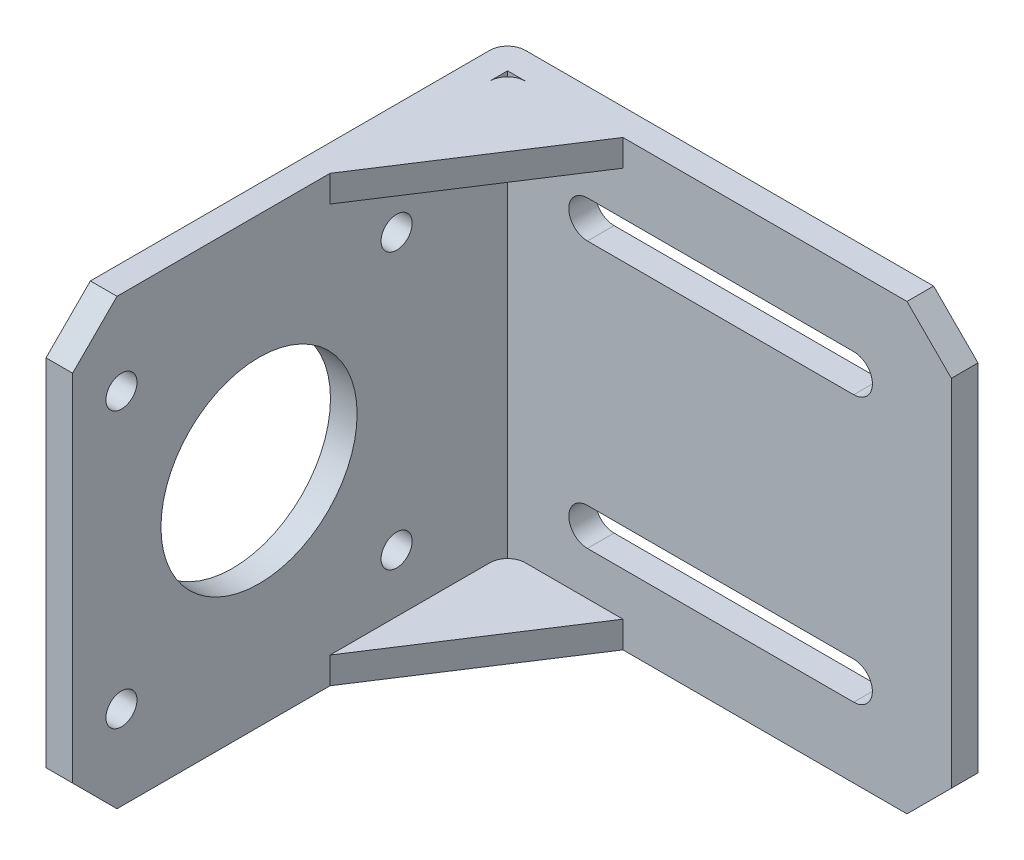
ISO-10303-21;
HEADER;
FILE_DESCRIPTION(('STEP AP214'),'2;1');
FILE_NAME('part.step','',(''),(''),'','','');
FILE_SCHEMA(('AUTOMOTIVE_DESIGN { 1 0 10303 214 1 1 1 1 }'));
ENDSEC;
DATA;
#1=APPLICATION_CONTEXT('core data for automotive mechanical design processes');
#2=APPLICATION_PROTOCOL_DEFINITION('international standard','automotive_design',2000,#1);
#3=PRODUCT_CONTEXT('',#1,'mechanical');
#4=PRODUCT('Part','Part','',(#3));
#5=PRODUCT_RELATED_PRODUCT_CATEGORY('part','',(#4));
#6=PRODUCT_DEFINITION_FORMATION('','',#4);
#7=PRODUCT_DEFINITION_CONTEXT('part definition',#1,'design');
#8=PRODUCT_DEFINITION('design','',#6,#7);
#9=PRODUCT_DEFINITION_SHAPE('','',#8);
#10=(LENGTH_UNIT() NAMED_UNIT(*) SI_UNIT(.MILLI.,.METRE.));
#11=(NAMED_UNIT(*) PLANE_ANGLE_UNIT() SI_UNIT($,.RADIAN.));
#12=(NAMED_UNIT(*) SI_UNIT($,.STERADIAN.) SOLID_ANGLE_UNIT());
#13=UNCERTAINTY_MEASURE_WITH_UNIT(LENGTH_MEASURE(1.E-05),#10,'distance_accuracy_value','');
#14=(GEOMETRIC_REPRESENTATION_CONTEXT(3) GLOBAL_UNCERTAINTY_ASSIGNED_CONTEXT((#13)) GLOBAL_UNIT_ASSIGNED_CONTEXT((#10,
#11,#12)) REPRESENTATION_CONTEXT('',''));
#15=CARTESIAN_POINT('',(0.,0.,0.));
#16=DIRECTION('',(0.,0.,1.));
#17=DIRECTION('',(1.,0.,0.));
#18=AXIS2_PLACEMENT_3D('',#15,#16,#17);
#19=CARTESIAN_POINT('',(0.,0.,3.));
#20=DIRECTION('',(0.,0.,1.));
#21=DIRECTION('',(1.,0.,0.));
#22=AXIS2_PLACEMENT_3D('',#19,#20,#21);
#23=PLANE('',#22);
#24=DIRECTION('',(1.,0.,0.));
#25=VECTOR('',#24,1.);
#26=CARTESIAN_POINT('',(-14.5,12.8966764515203,3.));
#27=LINE('',#26,#25);
#28=CARTESIAN_POINT('',(-14.5,12.8966764515203,3.));
#29=VERTEX_POINT('',#28);
#30=CARTESIAN_POINT('',(15.5,12.8966764515203,3.));
#31=VERTEX_POINT('',#30);
#32=EDGE_CURVE('E355',#29,#31,#27,.T.);
#33=ORIENTED_EDGE('',*,*,#32,.F.);
#34=CARTESIAN_POINT('',(-14.5,15.,3.));
#35=DIRECTION('',(0.,0.,1.));
#36=DIRECTION('',(1.,0.,0.));
#37=AXIS2_PLACEMENT_3D('',#34,#35,#36);
#38=CIRCLE('',#37,2.10332354847967);
#39=CARTESIAN_POINT('',(-14.5,17.1033235484797,3.));
#40=VERTEX_POINT('',#39);
#41=EDGE_CURVE('E353',#40,#29,#38,.T.);
#42=ORIENTED_EDGE('',*,*,#41,.F.);
#43=DIRECTION('',(-1.,0.,0.));
#44=VECTOR('',#43,1.);
#45=CARTESIAN_POINT('',(-14.5,17.1033235484797,3.));
#46=LINE('',#45,#44);
#47=CARTESIAN_POINT('',(15.5,17.1033235484797,3.));
#48=VERTEX_POINT('',#47);
#49=EDGE_CURVE('E361',#48,#40,#46,.T.);
#50=ORIENTED_EDGE('',*,*,#49,.F.);
#51=CARTESIAN_POINT('',(15.5,15.,3.));
#52=DIRECTION('',(0.,0.,1.));
#53=DIRECTION('',(1.,0.,0.));
#54=AXIS2_PLACEMENT_3D('',#51,#52,#53);
#55=CIRCLE('',#54,2.10332354847967);
#56=EDGE_CURVE('E358',#31,#48,#55,.T.);
#57=ORIENTED_EDGE('',*,*,#56,.F.);
#58=EDGE_LOOP('',(#33,#42,#50,#57));
#59=FACE_BOUND('',#58,.T.);
#60=DIRECTION('',(1.,0.,0.));
#61=VECTOR('',#60,1.);
#62=CARTESIAN_POINT('',(-14.5,-17.1,3.));
#63=LINE('',#62,#61);
#64=CARTESIAN_POINT('',(-14.5,-17.1,3.));
#65=VERTEX_POINT('',#64);
#66=CARTESIAN_POINT('',(15.5,-17.1,3.));
#67=VERTEX_POINT('',#66);
#68=EDGE_CURVE('E324',#65,#67,#63,.T.);
#69=ORIENTED_EDGE('',*,*,#68,.F.);
#70=CARTESIAN_POINT('',(-14.5,-15.,3.));
#71=DIRECTION('',(0.,0.,1.));
#72=DIRECTION('',(1.,0.,0.));
#73=AXIS2_PLACEMENT_3D('',#70,#71,#72);
#74=CIRCLE('',#73,2.1);
#75=CARTESIAN_POINT('',(-14.5,-12.9,3.));
#76=VERTEX_POINT('',#75);
#77=EDGE_CURVE('E322',#76,#65,#74,.T.);
#78=ORIENTED_EDGE('',*,*,#77,.F.);
#79=DIRECTION('',(-1.,0.,0.));
#80=VECTOR('',#79,1.);
#81=CARTESIAN_POINT('',(-14.5,-12.9,3.));
#82=LINE('',#81,#80);
#83=CARTESIAN_POINT('',(15.5,-12.9,3.));
#84=VERTEX_POINT('',#83);
#85=EDGE_CURVE('E330',#84,#76,#82,.T.);
#86=ORIENTED_EDGE('',*,*,#85,.F.);
#87=CARTESIAN_POINT('',(15.5,-15.,3.));
#88=DIRECTION('',(0.,0.,1.));
#89=DIRECTION('',(1.,0.,0.));
#90=AXIS2_PLACEMENT_3D('',#87,#88,#89);
#91=CIRCLE('',#90,2.1);
#92=EDGE_CURVE('E327',#67,#84,#91,.T.);
#93=ORIENTED_EDGE('',*,*,#92,.F.);
#94=EDGE_LOOP('',(#69,#78,#86,#93));
#95=FACE_BOUND('',#94,.T.);
#96=DIRECTION('',(-1.,0.,0.));
#97=VECTOR('',#96,1.);
#98=CARTESIAN_POINT('',(26.5,25.,3.));
#99=LINE('',#98,#97);
#100=CARTESIAN_POINT('',(21.5,25.,3.));
#101=VERTEX_POINT('',#100);
#102=CARTESIAN_POINT('',(-10.5,25.,3.));
#103=VERTEX_POINT('',#102);
#104=EDGE_CURVE('E391',#101,#103,#99,.T.);
#105=ORIENTED_EDGE('',*,*,#104,.T.);
#106=DIRECTION('',(0.,1.,0.));
#107=VECTOR('',#106,1.);
#108=CARTESIAN_POINT('',(-10.5,22.,3.));
#109=LINE('',#108,#107);
#110=CARTESIAN_POINT('',(-10.5,22.,3.));
#111=VERTEX_POINT('',#110);
#112=EDGE_CURVE('E60',#111,#103,#109,.T.);
#113=ORIENTED_EDGE('',*,*,#112,.F.);
#114=DIRECTION('',(1.,0.,0.));
#115=VECTOR('',#114,1.);
#116=CARTESIAN_POINT('',(-21.5,22.,3.));
#117=LINE('',#116,#115);
#118=CARTESIAN_POINT('',(-21.5,22.,3.));
#119=VERTEX_POINT('',#118);
#120=EDGE_CURVE('E55',#119,#111,#117,.T.);
#121=ORIENTED_EDGE('',*,*,#120,.F.);
#122=DIRECTION('',(0.,1.,0.));
#123=VECTOR('',#122,1.);
#124=CARTESIAN_POINT('',(-21.5,22.,3.));
#125=LINE('',#124,#123);
#126=CARTESIAN_POINT('',(-21.5,25.,3.));
#127=VERTEX_POINT('',#126);
#128=EDGE_CURVE('E234',#119,#127,#125,.T.);
#129=ORIENTED_EDGE('',*,*,#128,.T.);
#130=CARTESIAN_POINT('',(-23.5,25.,3.));
#131=VERTEX_POINT('',#130);
#132=EDGE_CURVE('E390',#127,#131,#99,.T.);
#133=ORIENTED_EDGE('',*,*,#132,.T.);
#134=DIRECTION('',(0.,-1.,0.));
#135=VECTOR('',#134,1.);
#136=CARTESIAN_POINT('',(-23.5,25.,3.));
#137=LINE('',#136,#135);
#138=CARTESIAN_POINT('',(-23.5,-25.,3.));
#139=VERTEX_POINT('',#138);
#140=EDGE_CURVE('E312',#131,#139,#137,.T.);
#141=ORIENTED_EDGE('',*,*,#140,.T.);
#142=DIRECTION('',(1.,0.,0.));
#143=VECTOR('',#142,1.);
#144=CARTESIAN_POINT('',(26.5,-25.,3.));
#145=LINE('',#144,#143);
#146=CARTESIAN_POINT('',(-21.5,-25.,3.));
#147=VERTEX_POINT('',#146);
#148=EDGE_CURVE('E384',#139,#147,#145,.T.);
#149=ORIENTED_EDGE('',*,*,#148,.T.);
#150=DIRECTION('',(0.,-1.,0.));
#151=VECTOR('',#150,1.);
#152=CARTESIAN_POINT('',(-21.5,-22.,3.));
#153=LINE('',#152,#151);
#154=CARTESIAN_POINT('',(-21.5,-22.,3.));
#155=VERTEX_POINT('',#154);
#156=EDGE_CURVE('E268',#155,#147,#153,.T.);
#157=ORIENTED_EDGE('',*,*,#156,.F.);
#158=DIRECTION('',(1.,0.,0.));
#159=VECTOR('',#158,1.);
#160=CARTESIAN_POINT('',(-21.5,-22.,3.));
#161=LINE('',#160,#159);
#162=CARTESIAN_POINT('',(-10.5,-22.,3.));
#163=VERTEX_POINT('',#162);
#164=EDGE_CURVE('E258',#155,#163,#161,.T.);
#165=ORIENTED_EDGE('',*,*,#164,.T.);
#166=DIRECTION('',(0.,-1.,0.));
#167=VECTOR('',#166,1.);
#168=CARTESIAN_POINT('',(-10.5,-22.,3.));
#169=LINE('',#168,#167);
#170=CARTESIAN_POINT('',(-10.5,-25.,3.));
#171=VERTEX_POINT('',#170);
#172=EDGE_CURVE('E264',#163,#171,#169,.T.);
#173=ORIENTED_EDGE('',*,*,#172,.T.);
#174=CARTESIAN_POINT('',(21.5,-25.,3.));
#175=VERTEX_POINT('',#174);
#176=EDGE_CURVE('E387',#171,#175,#145,.T.);
#177=ORIENTED_EDGE('',*,*,#176,.T.);
#178=DIRECTION('',(-0.707106781186549,-0.707106781186547,0.));
#179=VECTOR('',#178,1.);
#180=CARTESIAN_POINT('',(23.25,-23.25,3.));
#181=LINE('',#180,#179);
#182=CARTESIAN_POINT('',(26.5,-20.,3.));
#183=VERTEX_POINT('',#182);
#184=EDGE_CURVE('E424',#175,#183,#181,.F.);
#185=ORIENTED_EDGE('',*,*,#184,.T.);
#186=DIRECTION('',(0.,1.,0.));
#187=VECTOR('',#186,1.);
#188=CARTESIAN_POINT('',(26.5,-25.,3.));
#189=LINE('',#188,#187);
#190=CARTESIAN_POINT('',(26.5,20.,3.));
#191=VERTEX_POINT('',#190);
#192=EDGE_CURVE('E386',#183,#191,#189,.T.);
#193=ORIENTED_EDGE('',*,*,#192,.T.);
#194=DIRECTION('',(0.707106781186547,-0.707106781186549,0.));
#195=VECTOR('',#194,1.);
#196=CARTESIAN_POINT('',(23.25,23.25,3.));
#197=LINE('',#196,#195);
#198=EDGE_CURVE('E422',#191,#101,#197,.F.);
#199=ORIENTED_EDGE('',*,*,#198,.T.);
#200=EDGE_LOOP('',(#105,#113,#121,#129,#133,#141,#149,#157,#165,#173,#177,#185,#193,#199));
#201=FACE_BOUND('',#200,.T.);
#202=ADVANCED_FACE('F40',(#59,#95,#201),#23,.T.);
#203=CARTESIAN_POINT('',(-23.5,0.,0.));
#204=DIRECTION('',(1.,0.,0.));
#205=DIRECTION('',(0.,0.,-1.));
#206=AXIS2_PLACEMENT_3D('',#203,#204,#205);
#207=PLANE('',#206);
#208=CARTESIAN_POINT('',(-23.5,15.4999999999999,15.5));
#209=DIRECTION('',(-1.,0.,0.));
#210=DIRECTION('',(0.,0.,1.));
#211=AXIS2_PLACEMENT_3D('',#208,#209,#210);
#212=CIRCLE('',#211,1.75);
#213=CARTESIAN_POINT('',(-23.5,15.4999999999999,17.25));
#214=VERTEX_POINT('',#213);
#215=EDGE_CURVE('E276',#214,#214,#212,.T.);
#216=ORIENTED_EDGE('',*,*,#215,.T.);
#217=EDGE_LOOP('',(#216));
#218=FACE_BOUND('',#217,.T.);
#219=CARTESIAN_POINT('',(-23.5,-15.5000000000001,15.5));
#220=DIRECTION('',(-1.,0.,0.));
#221=DIRECTION('',(0.,0.,1.));
#222=AXIS2_PLACEMENT_3D('',#219,#220,#221);
#223=CIRCLE('',#222,1.75);
#224=CARTESIAN_POINT('',(-23.5,-15.5000000000001,17.25));
#225=VERTEX_POINT('',#224);
#226=EDGE_CURVE('E282',#225,#225,#223,.T.);
#227=ORIENTED_EDGE('',*,*,#226,.T.);
#228=EDGE_LOOP('',(#227));
#229=FACE_BOUND('',#228,.T.);
#230=CARTESIAN_POINT('',(-23.5,-15.5000000000001,46.5));
#231=DIRECTION('',(-1.,0.,0.));
#232=DIRECTION('',(0.,0.,1.));
#233=AXIS2_PLACEMENT_3D('',#230,#231,#232);
#234=CIRCLE('',#233,1.75);
#235=CARTESIAN_POINT('',(-23.5,-15.5000000000001,48.25));
#236=VERTEX_POINT('',#235);
#237=EDGE_CURVE('E288',#236,#236,#234,.T.);
#238=ORIENTED_EDGE('',*,*,#237,.T.);
#239=EDGE_LOOP('',(#238));
#240=FACE_BOUND('',#239,.T.);
#241=CARTESIAN_POINT('',(-23.5,15.4999999999999,46.5));
#242=DIRECTION('',(-1.,0.,0.));
#243=DIRECTION('',(0.,0.,1.));
#244=AXIS2_PLACEMENT_3D('',#241,#242,#243);
#245=CIRCLE('',#244,1.75);
#246=CARTESIAN_POINT('',(-23.5,15.4999999999999,48.25));
#247=VERTEX_POINT('',#246);
#248=EDGE_CURVE('E294',#247,#247,#245,.T.);
#249=ORIENTED_EDGE('',*,*,#248,.T.);
#250=EDGE_LOOP('',(#249));
#251=FACE_BOUND('',#250,.T.);
#252=CARTESIAN_POINT('',(-23.5,0.,31.));
#253=DIRECTION('',(-1.,0.,0.));
#254=DIRECTION('',(0.,0.,1.));
#255=AXIS2_PLACEMENT_3D('',#252,#253,#254);
#256=CIRCLE('',#255,11.05);
#257=CARTESIAN_POINT('',(-23.5,0.,42.05));
#258=VERTEX_POINT('',#257);
#259=EDGE_CURVE('E300',#258,#258,#256,.T.);
#260=ORIENTED_EDGE('',*,*,#259,.T.);
#261=EDGE_LOOP('',(#260));
#262=FACE_BOUND('',#261,.T.);
#263=DIRECTION('',(0.,0.,-1.));
#264=VECTOR('',#263,1.);
#265=CARTESIAN_POINT('',(-23.5,22.,5.));
#266=LINE('',#265,#264);
#267=CARTESIAN_POINT('',(-23.5,22.,23.));
#268=VERTEX_POINT('',#267);
#269=CARTESIAN_POINT('',(-23.5,22.,5.));
#270=VERTEX_POINT('',#269);
#271=EDGE_CURVE('E216',#268,#270,#266,.T.);
#272=ORIENTED_EDGE('',*,*,#271,.F.);
#273=DIRECTION('',(0.,1.,0.));
#274=VECTOR('',#273,1.);
#275=CARTESIAN_POINT('',(-23.5,22.,23.));
#276=LINE('',#275,#274);
#277=CARTESIAN_POINT('',(-23.5,25.,23.));
#278=VERTEX_POINT('',#277);
#279=EDGE_CURVE('E240',#268,#278,#276,.T.);
#280=ORIENTED_EDGE('',*,*,#279,.T.);
#281=DIRECTION('',(0.,0.,-1.));
#282=VECTOR('',#281,1.);
#283=CARTESIAN_POINT('',(-23.5,25.,3.));
#284=LINE('',#283,#282);
#285=CARTESIAN_POINT('',(-23.5,25.,47.));
#286=VERTEX_POINT('',#285);
#287=EDGE_CURVE('E309',#286,#278,#284,.T.);
#288=ORIENTED_EDGE('',*,*,#287,.F.);
#289=DIRECTION('',(0.,-0.707106781186547,0.707106781186549));
#290=VECTOR('',#289,1.);
#291=CARTESIAN_POINT('',(-23.5,36.,35.9999999999999));
#292=LINE('',#291,#290);
#293=CARTESIAN_POINT('',(-23.5,20.,52.));
#294=VERTEX_POINT('',#293);
#295=EDGE_CURVE('E440',#286,#294,#292,.T.);
#296=ORIENTED_EDGE('',*,*,#295,.T.);
#297=DIRECTION('',(0.,1.,0.));
#298=VECTOR('',#297,1.);
#299=CARTESIAN_POINT('',(-23.5,25.,52.));
#300=LINE('',#299,#298);
#301=CARTESIAN_POINT('',(-23.5,-20.,52.));
#302=VERTEX_POINT('',#301);
#303=EDGE_CURVE('E306',#302,#294,#300,.T.);
#304=ORIENTED_EDGE('',*,*,#303,.F.);
#305=DIRECTION('',(0.,-0.707106781186549,-0.707106781186546));
#306=VECTOR('',#305,1.);
#307=CARTESIAN_POINT('',(-23.5,-35.9999999999999,36.0000000000001));
#308=LINE('',#307,#306);
#309=CARTESIAN_POINT('',(-23.5,-25.,47.));
#310=VERTEX_POINT('',#309);
#311=EDGE_CURVE('E442',#302,#310,#308,.T.);
#312=ORIENTED_EDGE('',*,*,#311,.T.);
#313=DIRECTION('',(0.,0.,1.));
#314=VECTOR('',#313,1.);
#315=CARTESIAN_POINT('',(-23.5,-25.,52.));
#316=LINE('',#315,#314);
#317=CARTESIAN_POINT('',(-23.5,-25.,23.));
#318=VERTEX_POINT('',#317);
#319=EDGE_CURVE('E315',#318,#310,#316,.T.);
#320=ORIENTED_EDGE('',*,*,#319,.F.);
#321=DIRECTION('',(0.,-1.,0.));
#322=VECTOR('',#321,1.);
#323=CARTESIAN_POINT('',(-23.5,-22.,23.));
#324=LINE('',#323,#322);
#325=CARTESIAN_POINT('',(-23.5,-22.,23.));
#326=VERTEX_POINT('',#325);
#327=EDGE_CURVE('E260',#326,#318,#324,.T.);
#328=ORIENTED_EDGE('',*,*,#327,.F.);
#329=DIRECTION('',(0.,0.,-1.));
#330=VECTOR('',#329,1.);
#331=CARTESIAN_POINT('',(-23.5,-22.,5.));
#332=LINE('',#331,#330);
#333=CARTESIAN_POINT('',(-23.5,-22.,5.));
#334=VERTEX_POINT('',#333);
#335=EDGE_CURVE('E251',#326,#334,#332,.T.);
#336=ORIENTED_EDGE('',*,*,#335,.T.);
#337=DIRECTION('',(0.,-1.,0.));
#338=VECTOR('',#337,1.);
#339=CARTESIAN_POINT('',(-23.5,-22.,5.));
#340=LINE('',#339,#338);
#341=CARTESIAN_POINT('',(-23.5,-25.,5.));
#342=VERTEX_POINT('',#341);
#343=EDGE_CURVE('E271',#334,#342,#340,.T.);
#344=ORIENTED_EDGE('',*,*,#343,.T.);
#345=EDGE_CURVE('E316',#139,#342,#316,.T.);
#346=ORIENTED_EDGE('',*,*,#345,.F.);
#347=ORIENTED_EDGE('',*,*,#140,.F.);
#348=CARTESIAN_POINT('',(-23.5,25.,5.));
#349=VERTEX_POINT('',#348);
#350=EDGE_CURVE('E239',#349,#131,#284,.T.);
#351=ORIENTED_EDGE('',*,*,#350,.F.);
#352=DIRECTION('',(0.,1.,0.));
#353=VECTOR('',#352,1.);
#354=CARTESIAN_POINT('',(-23.5,22.,5.));
#355=LINE('',#354,#353);
#356=EDGE_CURVE('E232',#270,#349,#355,.T.);
#357=ORIENTED_EDGE('',*,*,#356,.F.);
#358=EDGE_LOOP('',(#272,#280,#288,#296,#304,#312,#320,#328,#336,#344,#346,#347,#351,#357));
#359=FACE_BOUND('',#358,.T.);
#360=ADVANCED_FACE('F236',(#218,#229,#240,#251,#262,#359),#207,.T.);
#361=CARTESIAN_POINT('',(0.,0.,0.));
#362=DIRECTION('',(0.,0.,1.));
#363=DIRECTION('',(1.,0.,0.));
#364=AXIS2_PLACEMENT_3D('',#361,#362,#363);
#365=PLANE('',#364);
#366=CARTESIAN_POINT('',(-14.5,15.,0.));
#367=DIRECTION('',(0.,0.,1.));
#368=DIRECTION('',(1.,0.,0.));
#369=AXIS2_PLACEMENT_3D('',#366,#367,#368);
#370=CIRCLE('',#369,2.10332354847967);
#371=CARTESIAN_POINT('',(-14.5,17.1033235484797,0.));
#372=VERTEX_POINT('',#371);
#373=CARTESIAN_POINT('',(-14.5,12.8966764515203,0.));
#374=VERTEX_POINT('',#373);
#375=EDGE_CURVE('E352',#372,#374,#370,.T.);
#376=ORIENTED_EDGE('',*,*,#375,.T.);
#377=DIRECTION('',(1.,0.,0.));
#378=VECTOR('',#377,1.);
#379=CARTESIAN_POINT('',(-14.5,12.8966764515203,0.));
#380=LINE('',#379,#378);
#381=CARTESIAN_POINT('',(15.5,12.8966764515203,0.));
#382=VERTEX_POINT('',#381);
#383=EDGE_CURVE('E366',#374,#382,#380,.T.);
#384=ORIENTED_EDGE('',*,*,#383,.T.);
#385=CARTESIAN_POINT('',(15.5,15.,0.));
#386=DIRECTION('',(0.,0.,1.));
#387=DIRECTION('',(1.,0.,0.));
#388=AXIS2_PLACEMENT_3D('',#385,#386,#387);
#389=CIRCLE('',#388,2.10332354847967);
#390=CARTESIAN_POINT('',(15.5,17.1033235484797,0.));
#391=VERTEX_POINT('',#390);
#392=EDGE_CURVE('E369',#382,#391,#389,.T.);
#393=ORIENTED_EDGE('',*,*,#392,.T.);
#394=DIRECTION('',(-1.,0.,0.));
#395=VECTOR('',#394,1.);
#396=CARTESIAN_POINT('',(-14.5,17.1033235484797,0.));
#397=LINE('',#396,#395);
#398=EDGE_CURVE('E356',#391,#372,#397,.T.);
#399=ORIENTED_EDGE('',*,*,#398,.T.);
#400=EDGE_LOOP('',(#376,#384,#393,#399));
#401=FACE_BOUND('',#400,.T.);
#402=DIRECTION('',(1.,0.,0.));
#403=VECTOR('',#402,1.);
#404=CARTESIAN_POINT('',(26.5,-25.,0.));
#405=LINE('',#404,#403);
#406=CARTESIAN_POINT('',(-24.5,-25.,0.));
#407=VERTEX_POINT('',#406);
#408=CARTESIAN_POINT('',(21.5,-25.,0.));
#409=VERTEX_POINT('',#408);
#410=EDGE_CURVE('E383',#407,#409,#405,.T.);
#411=ORIENTED_EDGE('',*,*,#410,.F.);
#412=DIRECTION('',(0.,-1.,0.));
#413=VECTOR('',#412,1.);
#414=CARTESIAN_POINT('',(-24.5,0.,0.));
#415=LINE('',#414,#413);
#416=CARTESIAN_POINT('',(-24.5,25.,0.));
#417=VERTEX_POINT('',#416);
#418=EDGE_CURVE('E48',#407,#417,#415,.F.);
#419=ORIENTED_EDGE('',*,*,#418,.T.);
#420=DIRECTION('',(-1.,0.,0.));
#421=VECTOR('',#420,1.);
#422=CARTESIAN_POINT('',(26.5,25.,0.));
#423=LINE('',#422,#421);
#424=CARTESIAN_POINT('',(21.5,25.,0.));
#425=VERTEX_POINT('',#424);
#426=EDGE_CURVE('E398',#425,#417,#423,.T.);
#427=ORIENTED_EDGE('',*,*,#426,.F.);
#428=DIRECTION('',(-0.707106781186547,0.707106781186549,0.));
#429=VECTOR('',#428,1.);
#430=CARTESIAN_POINT('',(21.5,25.,0.));
#431=LINE('',#430,#429);
#432=CARTESIAN_POINT('',(26.5,20.,0.));
#433=VERTEX_POINT('',#432);
#434=EDGE_CURVE('E411',#425,#433,#431,.F.);
#435=ORIENTED_EDGE('',*,*,#434,.T.);
#436=DIRECTION('',(0.,1.,0.));
#437=VECTOR('',#436,1.);
#438=CARTESIAN_POINT('',(26.5,-25.,0.));
#439=LINE('',#438,#437);
#440=CARTESIAN_POINT('',(26.5,-20.,0.));
#441=VERTEX_POINT('',#440);
#442=EDGE_CURVE('E395',#441,#433,#439,.T.);
#443=ORIENTED_EDGE('',*,*,#442,.F.);
#444=DIRECTION('',(0.707106781186549,0.707106781186547,0.));
#445=VECTOR('',#444,1.);
#446=CARTESIAN_POINT('',(26.5,-20.,0.));
#447=LINE('',#446,#445);
#448=EDGE_CURVE('E413',#441,#409,#447,.F.);
#449=ORIENTED_EDGE('',*,*,#448,.T.);
#450=EDGE_LOOP('',(#411,#419,#427,#435,#443,#449));
#451=FACE_BOUND('',#450,.T.);
#452=CARTESIAN_POINT('',(-14.5,-15.,0.));
#453=DIRECTION('',(0.,0.,1.));
#454=DIRECTION('',(1.,0.,0.));
#455=AXIS2_PLACEMENT_3D('',#452,#453,#454);
#456=CIRCLE('',#455,2.1);
#457=CARTESIAN_POINT('',(-14.5,-12.9,0.));
#458=VERTEX_POINT('',#457);
#459=CARTESIAN_POINT('',(-14.5,-17.1,0.));
#460=VERTEX_POINT('',#459);
#461=EDGE_CURVE('E319',#458,#460,#456,.T.);
#462=ORIENTED_EDGE('',*,*,#461,.T.);
#463=DIRECTION('',(1.,0.,0.));
#464=VECTOR('',#463,1.);
#465=CARTESIAN_POINT('',(-14.5,-17.1,0.));
#466=LINE('',#465,#464);
#467=CARTESIAN_POINT('',(15.5,-17.1,0.));
#468=VERTEX_POINT('',#467);
#469=EDGE_CURVE('E335',#460,#468,#466,.T.);
#470=ORIENTED_EDGE('',*,*,#469,.T.);
#471=CARTESIAN_POINT('',(15.5,-15.,0.));
#472=DIRECTION('',(0.,0.,1.));
#473=DIRECTION('',(1.,0.,0.));
#474=AXIS2_PLACEMENT_3D('',#471,#472,#473);
#475=CIRCLE('',#474,2.1);
#476=CARTESIAN_POINT('',(15.5,-12.9,0.));
#477=VERTEX_POINT('',#476);
#478=EDGE_CURVE('E338',#468,#477,#475,.T.);
#479=ORIENTED_EDGE('',*,*,#478,.T.);
#480=DIRECTION('',(-1.,0.,0.));
#481=VECTOR('',#480,1.);
#482=CARTESIAN_POINT('',(-14.5,-12.9,0.));
#483=LINE('',#482,#481);
#484=EDGE_CURVE('E325',#477,#458,#483,.T.);
#485=ORIENTED_EDGE('',*,*,#484,.T.);
#486=EDGE_LOOP('',(#462,#470,#479,#485));
#487=FACE_BOUND('',#486,.T.);
#488=ADVANCED_FACE('F453',(#401,#451,#487),#365,.F.);
#489=CARTESIAN_POINT('',(-26.5,-25.,3.));
#490=DIRECTION('',(1.,0.,0.));
#491=DIRECTION('',(0.,0.,-1.));
#492=AXIS2_PLACEMENT_3D('',#489,#490,#491);
#493=PLANE('',#492);
#494=DIRECTION('',(0.,0.,-1.));
#495=VECTOR('',#494,1.);
#496=CARTESIAN_POINT('',(-26.5,25.,3.));
#497=LINE('',#496,#495);
#498=CARTESIAN_POINT('',(-26.5,25.,47.));
#499=VERTEX_POINT('',#498);
#500=CARTESIAN_POINT('',(-26.5,25.,2.));
#501=VERTEX_POINT('',#500);
#502=EDGE_CURVE('E393',#499,#501,#497,.T.);
#503=ORIENTED_EDGE('',*,*,#502,.T.);
#504=DIRECTION('',(0.,-1.,0.));
#505=VECTOR('',#504,1.);
#506=CARTESIAN_POINT('',(-26.5,-25.,2.));
#507=LINE('',#506,#505);
#508=CARTESIAN_POINT('',(-26.5,-25.,2.));
#509=VERTEX_POINT('',#508);
#510=EDGE_CURVE('E445',#501,#509,#507,.T.);
#511=ORIENTED_EDGE('',*,*,#510,.T.);
#512=DIRECTION('',(0.,0.,-1.));
#513=VECTOR('',#512,1.);
#514=CARTESIAN_POINT('',(-26.5,-25.,3.));
#515=LINE('',#514,#513);
#516=CARTESIAN_POINT('',(-26.5,-25.,47.));
#517=VERTEX_POINT('',#516);
#518=EDGE_CURVE('E403',#517,#509,#515,.T.);
#519=ORIENTED_EDGE('',*,*,#518,.F.);
#520=DIRECTION('',(0.,0.707106781186549,0.707106781186546));
#521=VECTOR('',#520,1.);
#522=CARTESIAN_POINT('',(-26.5,-25.,47.));
#523=LINE('',#522,#521);
#524=CARTESIAN_POINT('',(-26.5,-20.,52.));
#525=VERTEX_POINT('',#524);
#526=EDGE_CURVE('E433',#517,#525,#523,.T.);
#527=ORIENTED_EDGE('',*,*,#526,.T.);
#528=DIRECTION('',(0.,1.,0.));
#529=VECTOR('',#528,1.);
#530=CARTESIAN_POINT('',(-26.5,25.,52.));
#531=LINE('',#530,#529);
#532=CARTESIAN_POINT('',(-26.5,20.,52.));
#533=VERTEX_POINT('',#532);
#534=EDGE_CURVE('E303',#525,#533,#531,.T.);
#535=ORIENTED_EDGE('',*,*,#534,.T.);
#536=DIRECTION('',(0.,0.707106781186547,-0.707106781186549));
#537=VECTOR('',#536,1.);
#538=CARTESIAN_POINT('',(-26.5,20.,52.));
#539=LINE('',#538,#537);
#540=EDGE_CURVE('E431',#533,#499,#539,.T.);
#541=ORIENTED_EDGE('',*,*,#540,.T.);
#542=EDGE_LOOP('',(#503,#511,#519,#527,#535,#541));
#543=FACE_BOUND('',#542,.T.);
#544=CARTESIAN_POINT('',(-26.5,15.4999999999999,15.5));
#545=DIRECTION('',(-1.,0.,0.));
#546=DIRECTION('',(0.,0.,1.));
#547=AXIS2_PLACEMENT_3D('',#544,#545,#546);
#548=CIRCLE('',#547,1.75);
#549=CARTESIAN_POINT('',(-26.5,15.4999999999999,17.25));
#550=VERTEX_POINT('',#549);
#551=EDGE_CURVE('E267',#550,#550,#548,.T.);
#552=ORIENTED_EDGE('',*,*,#551,.F.);
#553=EDGE_LOOP('',(#552));
#554=FACE_BOUND('',#553,.T.);
#555=CARTESIAN_POINT('',(-26.5,-15.5000000000001,15.5));
#556=DIRECTION('',(-1.,0.,0.));
#557=DIRECTION('',(0.,0.,1.));
#558=AXIS2_PLACEMENT_3D('',#555,#556,#557);
#559=CIRCLE('',#558,1.75);
#560=CARTESIAN_POINT('',(-26.5,-15.5000000000001,17.25));
#561=VERTEX_POINT('',#560);
#562=EDGE_CURVE('E279',#561,#561,#559,.T.);
#563=ORIENTED_EDGE('',*,*,#562,.F.);
#564=EDGE_LOOP('',(#563));
#565=FACE_BOUND('',#564,.T.);
#566=CARTESIAN_POINT('',(-26.5,-15.5000000000001,46.5));
#567=DIRECTION('',(-1.,0.,0.));
#568=DIRECTION('',(0.,0.,1.));
#569=AXIS2_PLACEMENT_3D('',#566,#567,#568);
#570=CIRCLE('',#569,1.75);
#571=CARTESIAN_POINT('',(-26.5,-15.5000000000001,48.25));
#572=VERTEX_POINT('',#571);
#573=EDGE_CURVE('E285',#572,#572,#570,.T.);
#574=ORIENTED_EDGE('',*,*,#573,.F.);
#575=EDGE_LOOP('',(#574));
#576=FACE_BOUND('',#575,.T.);
#577=CARTESIAN_POINT('',(-26.5,15.4999999999999,46.5));
#578=DIRECTION('',(-1.,0.,0.));
#579=DIRECTION('',(0.,0.,1.));
#580=AXIS2_PLACEMENT_3D('',#577,#578,#579);
#581=CIRCLE('',#580,1.75);
#582=CARTESIAN_POINT('',(-26.5,15.4999999999999,48.25));
#583=VERTEX_POINT('',#582);
#584=EDGE_CURVE('E291',#583,#583,#581,.T.);
#585=ORIENTED_EDGE('',*,*,#584,.F.);
#586=EDGE_LOOP('',(#585));
#587=FACE_BOUND('',#586,.T.);
#588=CARTESIAN_POINT('',(-26.5,0.,31.));
#589=DIRECTION('',(-1.,0.,0.));
#590=DIRECTION('',(0.,0.,1.));
#591=AXIS2_PLACEMENT_3D('',#588,#589,#590);
#592=CIRCLE('',#591,11.05);
#593=CARTESIAN_POINT('',(-26.5,0.,42.05));
#594=VERTEX_POINT('',#593);
#595=EDGE_CURVE('E297',#594,#594,#592,.T.);
#596=ORIENTED_EDGE('',*,*,#595,.F.);
#597=EDGE_LOOP('',(#596));
#598=FACE_BOUND('',#597,.T.);
#599=ADVANCED_FACE('F467',(#543,#554,#565,#576,#587,#598),#493,.F.);
#600=CARTESIAN_POINT('',(26.5,-25.,3.));
#601=DIRECTION('',(0.,1.,0.));
#602=DIRECTION('',(-1.,0.,0.));
#603=AXIS2_PLACEMENT_3D('',#600,#601,#602);
#604=PLANE('',#603);
#605=ORIENTED_EDGE('',*,*,#518,.T.);
#606=CARTESIAN_POINT('',(-24.5,-25.,2.));
#607=DIRECTION('',(0.,1.,0.));
#608=DIRECTION('',(-1.,0.,0.));
#609=AXIS2_PLACEMENT_3D('',#606,#607,#608);
#610=CIRCLE('',#609,2.);
#611=EDGE_CURVE('E448',#509,#407,#610,.F.);
#612=ORIENTED_EDGE('',*,*,#611,.T.);
#613=ORIENTED_EDGE('',*,*,#410,.T.);
#614=DIRECTION('',(0.,0.,1.));
#615=VECTOR('',#614,1.);
#616=CARTESIAN_POINT('',(21.5,-25.,3.));
#617=LINE('',#616,#615);
#618=EDGE_CURVE('E419',#409,#175,#617,.T.);
#619=ORIENTED_EDGE('',*,*,#618,.T.);
#620=ORIENTED_EDGE('',*,*,#176,.F.);
#621=DIRECTION('',(-0.544988350595414,0.,0.838443616300637));
#622=VECTOR('',#621,1.);
#623=CARTESIAN_POINT('',(-10.5,-25.,3.));
#624=LINE('',#623,#622);
#625=EDGE_CURVE('E242',#171,#318,#624,.T.);
#626=ORIENTED_EDGE('',*,*,#625,.T.);
#627=ORIENTED_EDGE('',*,*,#319,.T.);
#628=DIRECTION('',(-1.,0.,0.));
#629=VECTOR('',#628,1.);
#630=CARTESIAN_POINT('',(-26.5,-25.,47.));
#631=LINE('',#630,#629);
#632=EDGE_CURVE('E416',#310,#517,#631,.T.);
#633=ORIENTED_EDGE('',*,*,#632,.T.);
#634=EDGE_LOOP('',(#605,#612,#613,#619,#620,#626,#627,#633));
#635=FACE_BOUND('',#634,.T.);
#636=CARTESIAN_POINT('',(-21.5,-25.,5.));
#637=DIRECTION('',(0.,-1.,0.));
#638=DIRECTION('',(1.,0.,0.));
#639=AXIS2_PLACEMENT_3D('',#636,#637,#638);
#640=CIRCLE('',#639,2.);
#641=EDGE_CURVE('E252',#342,#147,#640,.T.);
#642=ORIENTED_EDGE('',*,*,#641,.T.);
#643=ORIENTED_EDGE('',*,*,#148,.F.);
#644=ORIENTED_EDGE('',*,*,#345,.T.);
#645=EDGE_LOOP('',(#642,#643,#644));
#646=FACE_BOUND('',#645,.T.);
#647=ADVANCED_FACE('F470',(#635,#646),#604,.F.);
#648=CARTESIAN_POINT('',(26.5,-25.,3.));
#649=DIRECTION('',(-1.,0.,0.));
#650=DIRECTION('',(0.,0.,1.));
#651=AXIS2_PLACEMENT_3D('',#648,#649,#650);
#652=PLANE('',#651);
#653=ORIENTED_EDGE('',*,*,#192,.F.);
#654=DIRECTION('',(0.,0.,-1.));
#655=VECTOR('',#654,1.);
#656=CARTESIAN_POINT('',(26.5,-20.,3.));
#657=LINE('',#656,#655);
#658=EDGE_CURVE('E408',#183,#441,#657,.T.);
#659=ORIENTED_EDGE('',*,*,#658,.T.);
#660=ORIENTED_EDGE('',*,*,#442,.T.);
#661=DIRECTION('',(0.,0.,1.));
#662=VECTOR('',#661,1.);
#663=CARTESIAN_POINT('',(26.5,20.,3.));
#664=LINE('',#663,#662);
#665=EDGE_CURVE('E406',#433,#191,#664,.T.);
#666=ORIENTED_EDGE('',*,*,#665,.T.);
#667=EDGE_LOOP('',(#653,#659,#660,#666));
#668=FACE_BOUND('',#667,.T.);
#669=ADVANCED_FACE('F514',(#668),#652,.F.);
#670=CARTESIAN_POINT('',(26.5,25.,3.));
#671=DIRECTION('',(0.,-1.,0.));
#672=DIRECTION('',(1.,0.,0.));
#673=AXIS2_PLACEMENT_3D('',#670,#671,#672);
#674=PLANE('',#673);
#675=DIRECTION('',(-0.544988350595414,0.,0.838443616300637));
#676=VECTOR('',#675,1.);
#677=CARTESIAN_POINT('',(-10.5,25.,3.));
#678=LINE('',#677,#676);
#679=EDGE_CURVE('E490',#103,#278,#678,.T.);
#680=ORIENTED_EDGE('',*,*,#679,.F.);
#681=ORIENTED_EDGE('',*,*,#104,.F.);
#682=DIRECTION('',(0.,0.,-1.));
#683=VECTOR('',#682,1.);
#684=CARTESIAN_POINT('',(21.5,25.,3.));
#685=LINE('',#684,#683);
#686=EDGE_CURVE('E428',#101,#425,#685,.T.);
#687=ORIENTED_EDGE('',*,*,#686,.T.);
#688=ORIENTED_EDGE('',*,*,#426,.T.);
#689=CARTESIAN_POINT('',(-24.5,25.,2.));
#690=DIRECTION('',(0.,-1.,0.));
#691=DIRECTION('',(1.,0.,0.));
#692=AXIS2_PLACEMENT_3D('',#689,#690,#691);
#693=CIRCLE('',#692,2.);
#694=EDGE_CURVE('E11',#417,#501,#693,.F.);
#695=ORIENTED_EDGE('',*,*,#694,.T.);
#696=ORIENTED_EDGE('',*,*,#502,.F.);
#697=DIRECTION('',(1.,0.,0.));
#698=VECTOR('',#697,1.);
#699=CARTESIAN_POINT('',(-23.5,25.,47.));
#700=LINE('',#699,#698);
#701=EDGE_CURVE('E426',#499,#286,#700,.T.);
#702=ORIENTED_EDGE('',*,*,#701,.T.);
#703=ORIENTED_EDGE('',*,*,#287,.T.);
#704=EDGE_LOOP('',(#680,#681,#687,#688,#695,#696,#702,#703));
#705=FACE_BOUND('',#704,.T.);
#706=ORIENTED_EDGE('',*,*,#132,.F.);
#707=CARTESIAN_POINT('',(-21.5,25.,5.));
#708=DIRECTION('',(0.,-1.,0.));
#709=DIRECTION('',(1.,0.,0.));
#710=AXIS2_PLACEMENT_3D('',#707,#708,#709);
#711=CIRCLE('',#710,2.);
#712=EDGE_CURVE('E491',#349,#127,#711,.T.);
#713=ORIENTED_EDGE('',*,*,#712,.F.);
#714=ORIENTED_EDGE('',*,*,#350,.T.);
#715=EDGE_LOOP('',(#706,#713,#714));
#716=FACE_BOUND('',#715,.T.);
#717=ADVANCED_FACE('F459',(#705,#716),#674,.F.);
#718=CARTESIAN_POINT('',(-14.5,15.,3.));
#719=DIRECTION('',(0.,0.,-1.));
#720=DIRECTION('',(-1.,0.,0.));
#721=AXIS2_PLACEMENT_3D('',#718,#719,#720);
#722=CYLINDRICAL_SURFACE('',#721,2.10332354847967);
#723=ORIENTED_EDGE('',*,*,#375,.F.);
#724=DIRECTION('',(0.,0.,-1.));
#725=VECTOR('',#724,1.);
#726=CARTESIAN_POINT('',(-14.5,17.1033235484797,3.));
#727=LINE('',#726,#725);
#728=EDGE_CURVE('E363',#40,#372,#727,.T.);
#729=ORIENTED_EDGE('',*,*,#728,.F.);
#730=ORIENTED_EDGE('',*,*,#41,.T.);
#731=DIRECTION('',(0.,0.,-1.));
#732=VECTOR('',#731,1.);
#733=CARTESIAN_POINT('',(-14.5,12.8966764515203,3.));
#734=LINE('',#733,#732);
#735=EDGE_CURVE('E380',#29,#374,#734,.T.);
#736=ORIENTED_EDGE('',*,*,#735,.T.);
#737=EDGE_LOOP('',(#723,#729,#730,#736));
#738=FACE_BOUND('',#737,.T.);
#739=ADVANCED_FACE('F507',(#738),#722,.F.);
#740=CARTESIAN_POINT('',(-14.5,12.8966764515203,3.));
#741=DIRECTION('',(0.,1.,0.));
#742=DIRECTION('',(0.,0.,1.));
#743=AXIS2_PLACEMENT_3D('',#740,#741,#742);
#744=PLANE('',#743);
#745=ORIENTED_EDGE('',*,*,#383,.F.);
#746=ORIENTED_EDGE('',*,*,#735,.F.);
#747=ORIENTED_EDGE('',*,*,#32,.T.);
#748=DIRECTION('',(0.,0.,-1.));
#749=VECTOR('',#748,1.);
#750=CARTESIAN_POINT('',(15.5,12.8966764515203,3.));
#751=LINE('',#750,#749);
#752=EDGE_CURVE('E378',#31,#382,#751,.T.);
#753=ORIENTED_EDGE('',*,*,#752,.T.);
#754=EDGE_LOOP('',(#745,#746,#747,#753));
#755=FACE_BOUND('',#754,.T.);
#756=ADVANCED_FACE('F604',(#755),#744,.T.);
#757=CARTESIAN_POINT('',(15.5,15.,3.));
#758=DIRECTION('',(0.,0.,-1.));
#759=DIRECTION('',(-1.,0.,0.));
#760=AXIS2_PLACEMENT_3D('',#757,#758,#759);
#761=CYLINDRICAL_SURFACE('',#760,2.10332354847967);
#762=ORIENTED_EDGE('',*,*,#392,.F.);
#763=ORIENTED_EDGE('',*,*,#752,.F.);
#764=ORIENTED_EDGE('',*,*,#56,.T.);
#765=DIRECTION('',(0.,0.,-1.));
#766=VECTOR('',#765,1.);
#767=CARTESIAN_POINT('',(15.5,17.1033235484797,3.));
#768=LINE('',#767,#766);
#769=EDGE_CURVE('E376',#48,#391,#768,.T.);
#770=ORIENTED_EDGE('',*,*,#769,.T.);
#771=EDGE_LOOP('',(#762,#763,#764,#770));
#772=FACE_BOUND('',#771,.T.);
#773=ADVANCED_FACE('F601',(#772),#761,.F.);
#774=CARTESIAN_POINT('',(-14.5,17.1033235484797,3.));
#775=DIRECTION('',(0.,-1.,0.));
#776=DIRECTION('',(0.,0.,-1.));
#777=AXIS2_PLACEMENT_3D('',#774,#775,#776);
#778=PLANE('',#777);
#779=ORIENTED_EDGE('',*,*,#398,.F.);
#780=ORIENTED_EDGE('',*,*,#769,.F.);
#781=ORIENTED_EDGE('',*,*,#49,.T.);
#782=ORIENTED_EDGE('',*,*,#728,.T.);
#783=EDGE_LOOP('',(#779,#780,#781,#782));
#784=FACE_BOUND('',#783,.T.);
#785=ADVANCED_FACE('F597',(#784),#778,.T.);
#786=CARTESIAN_POINT('',(-14.5,-15.,3.));
#787=DIRECTION('',(0.,0.,-1.));
#788=DIRECTION('',(-1.,0.,0.));
#789=AXIS2_PLACEMENT_3D('',#786,#787,#788);
#790=CYLINDRICAL_SURFACE('',#789,2.1);
#791=ORIENTED_EDGE('',*,*,#461,.F.);
#792=DIRECTION('',(0.,0.,-1.));
#793=VECTOR('',#792,1.);
#794=CARTESIAN_POINT('',(-14.5,-12.9,3.));
#795=LINE('',#794,#793);
#796=EDGE_CURVE('E332',#76,#458,#795,.T.);
#797=ORIENTED_EDGE('',*,*,#796,.F.);
#798=ORIENTED_EDGE('',*,*,#77,.T.);
#799=DIRECTION('',(0.,0.,-1.));
#800=VECTOR('',#799,1.);
#801=CARTESIAN_POINT('',(-14.5,-17.1,3.));
#802=LINE('',#801,#800);
#803=EDGE_CURVE('E349',#65,#460,#802,.T.);
#804=ORIENTED_EDGE('',*,*,#803,.T.);
#805=EDGE_LOOP('',(#791,#797,#798,#804));
#806=FACE_BOUND('',#805,.T.);
#807=ADVANCED_FACE('F593',(#806),#790,.F.);
#808=CARTESIAN_POINT('',(-14.5,-17.1,3.));
#809=DIRECTION('',(0.,1.,0.));
#810=DIRECTION('',(0.,0.,1.));
#811=AXIS2_PLACEMENT_3D('',#808,#809,#810);
#812=PLANE('',#811);
#813=ORIENTED_EDGE('',*,*,#469,.F.);
#814=ORIENTED_EDGE('',*,*,#803,.F.);
#815=ORIENTED_EDGE('',*,*,#68,.T.);
#816=DIRECTION('',(0.,0.,-1.));
#817=VECTOR('',#816,1.);
#818=CARTESIAN_POINT('',(15.5,-17.1,3.));
#819=LINE('',#818,#817);
#820=EDGE_CURVE('E347',#67,#468,#819,.T.);
#821=ORIENTED_EDGE('',*,*,#820,.T.);
#822=EDGE_LOOP('',(#813,#814,#815,#821));
#823=FACE_BOUND('',#822,.T.);
#824=ADVANCED_FACE('F589',(#823),#812,.T.);
#825=CARTESIAN_POINT('',(15.5,-15.,3.));
#826=DIRECTION('',(0.,0.,-1.));
#827=DIRECTION('',(-1.,0.,0.));
#828=AXIS2_PLACEMENT_3D('',#825,#826,#827);
#829=CYLINDRICAL_SURFACE('',#828,2.1);
#830=ORIENTED_EDGE('',*,*,#478,.F.);
#831=ORIENTED_EDGE('',*,*,#820,.F.);
#832=ORIENTED_EDGE('',*,*,#92,.T.);
#833=DIRECTION('',(0.,0.,-1.));
#834=VECTOR('',#833,1.);
#835=CARTESIAN_POINT('',(15.5,-12.9,3.));
#836=LINE('',#835,#834);
#837=EDGE_CURVE('E345',#84,#477,#836,.T.);
#838=ORIENTED_EDGE('',*,*,#837,.T.);
#839=EDGE_LOOP('',(#830,#831,#832,#838));
#840=FACE_BOUND('',#839,.T.);
#841=ADVANCED_FACE('F585',(#840),#829,.F.);
#842=CARTESIAN_POINT('',(-14.5,-12.9,3.));
#843=DIRECTION('',(0.,-1.,0.));
#844=DIRECTION('',(0.,0.,-1.));
#845=AXIS2_PLACEMENT_3D('',#842,#843,#844);
#846=PLANE('',#845);
#847=ORIENTED_EDGE('',*,*,#484,.F.);
#848=ORIENTED_EDGE('',*,*,#837,.F.);
#849=ORIENTED_EDGE('',*,*,#85,.T.);
#850=ORIENTED_EDGE('',*,*,#796,.T.);
#851=EDGE_LOOP('',(#847,#848,#849,#850));
#852=FACE_BOUND('',#851,.T.);
#853=ADVANCED_FACE('F582',(#852),#846,.T.);
#854=CARTESIAN_POINT('',(-23.5,25.,52.));
#855=DIRECTION('',(0.,0.,1.));
#856=DIRECTION('',(0.,-1.,0.));
#857=AXIS2_PLACEMENT_3D('',#854,#855,#856);
#858=PLANE('',#857);
#859=ORIENTED_EDGE('',*,*,#534,.F.);
#860=DIRECTION('',(1.,0.,0.));
#861=VECTOR('',#860,1.);
#862=CARTESIAN_POINT('',(-23.5,-20.,52.));
#863=LINE('',#862,#861);
#864=EDGE_CURVE('E438',#525,#302,#863,.T.);
#865=ORIENTED_EDGE('',*,*,#864,.T.);
#866=ORIENTED_EDGE('',*,*,#303,.T.);
#867=DIRECTION('',(-1.,0.,0.));
#868=VECTOR('',#867,1.);
#869=CARTESIAN_POINT('',(-26.5,20.,52.));
#870=LINE('',#869,#868);
#871=EDGE_CURVE('E435',#294,#533,#870,.T.);
#872=ORIENTED_EDGE('',*,*,#871,.T.);
#873=EDGE_LOOP('',(#859,#865,#866,#872));
#874=FACE_BOUND('',#873,.T.);
#875=ADVANCED_FACE('F480',(#874),#858,.T.);
#876=CARTESIAN_POINT('',(-23.5,0.,31.));
#877=DIRECTION('',(-1.,0.,0.));
#878=DIRECTION('',(0.,0.,1.));
#879=AXIS2_PLACEMENT_3D('',#876,#877,#878);
#880=CYLINDRICAL_SURFACE('',#879,11.05);
#881=ORIENTED_EDGE('',*,*,#259,.F.);
#882=EDGE_LOOP('',(#881));
#883=FACE_BOUND('',#882,.T.);
#884=ORIENTED_EDGE('',*,*,#595,.T.);
#885=EDGE_LOOP('',(#884));
#886=FACE_BOUND('',#885,.T.);
#887=ADVANCED_FACE('F575',(#883,#886),#880,.F.);
#888=CARTESIAN_POINT('',(-23.5,15.4999999999999,46.5));
#889=DIRECTION('',(-1.,0.,0.));
#890=DIRECTION('',(0.,0.,1.));
#891=AXIS2_PLACEMENT_3D('',#888,#889,#890);
#892=CYLINDRICAL_SURFACE('',#891,1.75);
#893=ORIENTED_EDGE('',*,*,#248,.F.);
#894=EDGE_LOOP('',(#893));
#895=FACE_BOUND('',#894,.T.);
#896=ORIENTED_EDGE('',*,*,#584,.T.);
#897=EDGE_LOOP('',(#896));
#898=FACE_BOUND('',#897,.T.);
#899=ADVANCED_FACE('F571',(#895,#898),#892,.F.);
#900=CARTESIAN_POINT('',(-23.5,-15.5000000000001,46.5));
#901=DIRECTION('',(-1.,0.,0.));
#902=DIRECTION('',(0.,0.,1.));
#903=AXIS2_PLACEMENT_3D('',#900,#901,#902);
#904=CYLINDRICAL_SURFACE('',#903,1.75);
#905=ORIENTED_EDGE('',*,*,#237,.F.);
#906=EDGE_LOOP('',(#905));
#907=FACE_BOUND('',#906,.T.);
#908=ORIENTED_EDGE('',*,*,#573,.T.);
#909=EDGE_LOOP('',(#908));
#910=FACE_BOUND('',#909,.T.);
#911=ADVANCED_FACE('F567',(#907,#910),#904,.F.);
#912=CARTESIAN_POINT('',(-23.5,-15.5000000000001,15.5));
#913=DIRECTION('',(-1.,0.,0.));
#914=DIRECTION('',(0.,0.,1.));
#915=AXIS2_PLACEMENT_3D('',#912,#913,#914);
#916=CYLINDRICAL_SURFACE('',#915,1.75);
#917=ORIENTED_EDGE('',*,*,#226,.F.);
#918=EDGE_LOOP('',(#917));
#919=FACE_BOUND('',#918,.T.);
#920=ORIENTED_EDGE('',*,*,#562,.T.);
#921=EDGE_LOOP('',(#920));
#922=FACE_BOUND('',#921,.T.);
#923=ADVANCED_FACE('F563',(#919,#922),#916,.F.);
#924=CARTESIAN_POINT('',(-23.5,15.4999999999999,15.5));
#925=DIRECTION('',(-1.,0.,0.));
#926=DIRECTION('',(0.,0.,1.));
#927=AXIS2_PLACEMENT_3D('',#924,#925,#926);
#928=CYLINDRICAL_SURFACE('',#927,1.75);
#929=ORIENTED_EDGE('',*,*,#215,.F.);
#930=EDGE_LOOP('',(#929));
#931=FACE_BOUND('',#930,.T.);
#932=ORIENTED_EDGE('',*,*,#551,.T.);
#933=EDGE_LOOP('',(#932));
#934=FACE_BOUND('',#933,.T.);
#935=ADVANCED_FACE('F530',(#931,#934),#928,.F.);
#936=CARTESIAN_POINT('',(26.5,-20.,3.));
#937=DIRECTION('',(-0.707106781186546,0.707106781186548,0.));
#938=DIRECTION('',(0.,0.,-1.));
#939=AXIS2_PLACEMENT_3D('',#936,#937,#938);
#940=PLANE('',#939);
#941=ORIENTED_EDGE('',*,*,#184,.F.);
#942=ORIENTED_EDGE('',*,*,#618,.F.);
#943=ORIENTED_EDGE('',*,*,#448,.F.);
#944=ORIENTED_EDGE('',*,*,#658,.F.);
#945=EDGE_LOOP('',(#941,#942,#943,#944));
#946=FACE_BOUND('',#945,.T.);
#947=ADVANCED_FACE('F523',(#946),#940,.F.);
#948=CARTESIAN_POINT('',(21.5,25.,3.));
#949=DIRECTION('',(-0.707106781186548,-0.707106781186546,0.));
#950=DIRECTION('',(0.,0.,-1.));
#951=AXIS2_PLACEMENT_3D('',#948,#949,#950);
#952=PLANE('',#951);
#953=ORIENTED_EDGE('',*,*,#198,.F.);
#954=ORIENTED_EDGE('',*,*,#665,.F.);
#955=ORIENTED_EDGE('',*,*,#434,.F.);
#956=ORIENTED_EDGE('',*,*,#686,.F.);
#957=EDGE_LOOP('',(#953,#954,#955,#956));
#958=FACE_BOUND('',#957,.T.);
#959=ADVANCED_FACE('F529',(#958),#952,.F.);
#960=CARTESIAN_POINT('',(26.5,-25.,47.));
#961=DIRECTION('',(0.,-0.707106781186545,0.707106781186549));
#962=DIRECTION('',(1.,0.,0.));
#963=AXIS2_PLACEMENT_3D('',#960,#961,#962);
#964=PLANE('',#963);
#965=ORIENTED_EDGE('',*,*,#311,.F.);
#966=ORIENTED_EDGE('',*,*,#864,.F.);
#967=ORIENTED_EDGE('',*,*,#526,.F.);
#968=ORIENTED_EDGE('',*,*,#632,.F.);
#969=EDGE_LOOP('',(#965,#966,#967,#968));
#970=FACE_BOUND('',#969,.T.);
#971=ADVANCED_FACE('F476',(#970),#964,.T.);
#972=CARTESIAN_POINT('',(-23.5,20.,52.));
#973=DIRECTION('',(0.,0.707106781186548,0.707106781186546));
#974=DIRECTION('',(1.,0.,0.));
#975=AXIS2_PLACEMENT_3D('',#972,#973,#974);
#976=PLANE('',#975);
#977=ORIENTED_EDGE('',*,*,#295,.F.);
#978=ORIENTED_EDGE('',*,*,#701,.F.);
#979=ORIENTED_EDGE('',*,*,#540,.F.);
#980=ORIENTED_EDGE('',*,*,#871,.F.);
#981=EDGE_LOOP('',(#977,#978,#979,#980));
#982=FACE_BOUND('',#981,.T.);
#983=ADVANCED_FACE('F485',(#982),#976,.T.);
#984=CARTESIAN_POINT('',(-10.5,-22.,3.));
#985=DIRECTION('',(0.838443616300637,0.,0.544988350595414));
#986=DIRECTION('',(0.544988350595414,0.,-0.838443616300637));
#987=AXIS2_PLACEMENT_3D('',#984,#985,#986);
#988=PLANE('',#987);
#989=ORIENTED_EDGE('',*,*,#625,.F.);
#990=ORIENTED_EDGE('',*,*,#172,.F.);
#991=DIRECTION('',(-0.544988350595414,0.,0.838443616300637));
#992=VECTOR('',#991,1.);
#993=CARTESIAN_POINT('',(-10.5,-22.,3.));
#994=LINE('',#993,#992);
#995=EDGE_CURVE('E248',#163,#326,#994,.T.);
#996=ORIENTED_EDGE('',*,*,#995,.T.);
#997=ORIENTED_EDGE('',*,*,#327,.T.);
#998=EDGE_LOOP('',(#989,#990,#996,#997));
#999=FACE_BOUND('',#998,.T.);
#1000=ADVANCED_FACE('F545',(#999),#988,.T.);
#1001=CARTESIAN_POINT('',(-21.5,-22.,5.));
#1002=DIRECTION('',(0.,-1.,0.));
#1003=DIRECTION('',(1.,0.,0.));
#1004=AXIS2_PLACEMENT_3D('',#1001,#1002,#1003);
#1005=CYLINDRICAL_SURFACE('',#1004,2.);
#1006=ORIENTED_EDGE('',*,*,#641,.F.);
#1007=ORIENTED_EDGE('',*,*,#343,.F.);
#1008=CARTESIAN_POINT('',(-21.5,-22.,5.));
#1009=DIRECTION('',(0.,-1.,0.));
#1010=DIRECTION('',(1.,0.,0.));
#1011=AXIS2_PLACEMENT_3D('',#1008,#1009,#1010);
#1012=CIRCLE('',#1011,2.);
#1013=EDGE_CURVE('E255',#334,#155,#1012,.T.);
#1014=ORIENTED_EDGE('',*,*,#1013,.T.);
#1015=ORIENTED_EDGE('',*,*,#156,.T.);
#1016=EDGE_LOOP('',(#1006,#1007,#1014,#1015));
#1017=FACE_BOUND('',#1016,.T.);
#1018=ADVANCED_FACE('F549',(#1017),#1005,.T.);
#1019=CARTESIAN_POINT('',(-21.5,-22.,5.));
#1020=DIRECTION('',(0.,-1.,0.));
#1021=DIRECTION('',(1.,0.,0.));
#1022=AXIS2_PLACEMENT_3D('',#1019,#1020,#1021);
#1023=PLANE('',#1022);
#1024=ORIENTED_EDGE('',*,*,#995,.F.);
#1025=ORIENTED_EDGE('',*,*,#164,.F.);
#1026=ORIENTED_EDGE('',*,*,#1013,.F.);
#1027=ORIENTED_EDGE('',*,*,#335,.F.);
#1028=EDGE_LOOP('',(#1024,#1025,#1026,#1027));
#1029=FACE_BOUND('',#1028,.T.);
#1030=ADVANCED_FACE('F555',(#1029),#1023,.F.);
#1031=CARTESIAN_POINT('',(-24.5,-25.,2.));
#1032=DIRECTION('',(0.,-1.,0.));
#1033=DIRECTION('',(0.,0.,-1.));
#1034=AXIS2_PLACEMENT_3D('',#1031,#1032,#1033);
#1035=CYLINDRICAL_SURFACE('',#1034,2.);
#1036=ORIENTED_EDGE('',*,*,#694,.F.);
#1037=ORIENTED_EDGE('',*,*,#418,.F.);
#1038=ORIENTED_EDGE('',*,*,#611,.F.);
#1039=ORIENTED_EDGE('',*,*,#510,.F.);
#1040=EDGE_LOOP('',(#1036,#1037,#1038,#1039));
#1041=FACE_BOUND('',#1040,.T.);
#1042=ADVANCED_FACE('F42',(#1041),#1035,.T.);
#1043=CARTESIAN_POINT('',(-10.5,22.,3.));
#1044=DIRECTION('',(-0.838443616300637,0.,-0.544988350595414));
#1045=DIRECTION('',(-0.544988350595414,0.,0.838443616300637));
#1046=AXIS2_PLACEMENT_3D('',#1043,#1044,#1045);
#1047=PLANE('',#1046);
#1048=ORIENTED_EDGE('',*,*,#679,.T.);
#1049=ORIENTED_EDGE('',*,*,#279,.F.);
#1050=DIRECTION('',(-0.544988350595414,0.,0.838443616300637));
#1051=VECTOR('',#1050,1.);
#1052=CARTESIAN_POINT('',(-10.5,22.,3.));
#1053=LINE('',#1052,#1051);
#1054=EDGE_CURVE('E222',#111,#268,#1053,.T.);
#1055=ORIENTED_EDGE('',*,*,#1054,.F.);
#1056=ORIENTED_EDGE('',*,*,#112,.T.);
#1057=EDGE_LOOP('',(#1048,#1049,#1055,#1056));
#1058=FACE_BOUND('',#1057,.T.);
#1059=ADVANCED_FACE('F489',(#1058),#1047,.F.);
#1060=CARTESIAN_POINT('',(-21.5,22.,5.));
#1061=DIRECTION('',(0.,1.,0.));
#1062=DIRECTION('',(-1.,0.,0.));
#1063=AXIS2_PLACEMENT_3D('',#1060,#1061,#1062);
#1064=CYLINDRICAL_SURFACE('',#1063,2.);
#1065=ORIENTED_EDGE('',*,*,#712,.T.);
#1066=ORIENTED_EDGE('',*,*,#128,.F.);
#1067=CARTESIAN_POINT('',(-21.5,22.,5.));
#1068=DIRECTION('',(0.,-1.,0.));
#1069=DIRECTION('',(1.,0.,0.));
#1070=AXIS2_PLACEMENT_3D('',#1067,#1068,#1069);
#1071=CIRCLE('',#1070,2.);
#1072=EDGE_CURVE('E219',#270,#119,#1071,.T.);
#1073=ORIENTED_EDGE('',*,*,#1072,.F.);
#1074=ORIENTED_EDGE('',*,*,#356,.T.);
#1075=EDGE_LOOP('',(#1065,#1066,#1073,#1074));
#1076=FACE_BOUND('',#1075,.T.);
#1077=ADVANCED_FACE('F231',(#1076),#1064,.T.);
#1078=CARTESIAN_POINT('',(-21.5,22.,5.));
#1079=DIRECTION('',(0.,1.,0.));
#1080=DIRECTION('',(1.,0.,0.));
#1081=AXIS2_PLACEMENT_3D('',#1078,#1079,#1080);
#1082=PLANE('',#1081);
#1083=ORIENTED_EDGE('',*,*,#1054,.T.);
#1084=ORIENTED_EDGE('',*,*,#271,.T.);
#1085=ORIENTED_EDGE('',*,*,#1072,.T.);
#1086=ORIENTED_EDGE('',*,*,#120,.T.);
#1087=EDGE_LOOP('',(#1083,#1084,#1085,#1086));
#1088=FACE_BOUND('',#1087,.T.);
#1089=ADVANCED_FACE('F218',(#1088),#1082,.F.);
#1090=CLOSED_SHELL('',(#202,#360,#488,#599,#647,#669,#717,#739,#756,#773,#785,#807,#824,#841,
#853,#875,#887,#899,#911,#923,#935,#947,#959,#971,#983,#1000,#1018,#1030,#1042,#1059,#1077,#1089));
#1091=MANIFOLD_SOLID_BREP('B2',#1090);
#1092=ADVANCED_BREP_SHAPE_REPRESENTATION('',(#18,#1091),#14);
#1093=SHAPE_DEFINITION_REPRESENTATION(#9,#1092);
ENDSEC;
END-ISO-10303-21;
